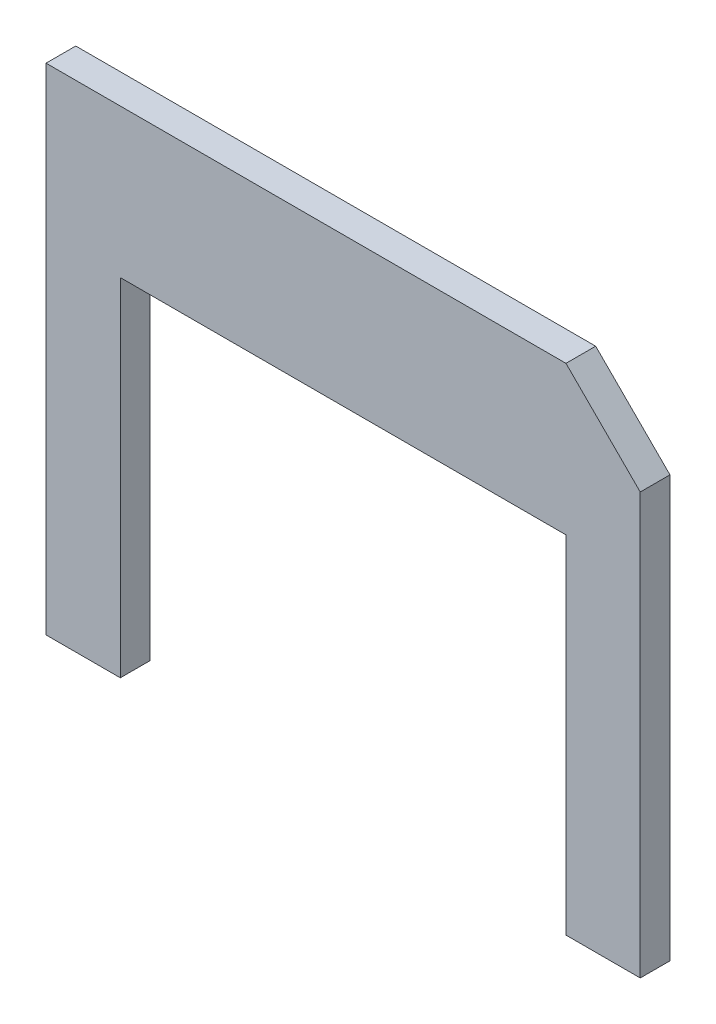
ISO-10303-21;
HEADER;
FILE_DESCRIPTION(('STEP AP214'),'2;1');
FILE_NAME('part.step','',(''),(''),'','','');
FILE_SCHEMA(('AUTOMOTIVE_DESIGN { 1 0 10303 214 1 1 1 1 }'));
ENDSEC;
DATA;
#1=APPLICATION_CONTEXT('core data for automotive mechanical design processes');
#2=APPLICATION_PROTOCOL_DEFINITION('international standard','automotive_design',2000,#1);
#3=PRODUCT_CONTEXT('',#1,'mechanical');
#4=PRODUCT('Part','Part','',(#3));
#5=PRODUCT_RELATED_PRODUCT_CATEGORY('part','',(#4));
#6=PRODUCT_DEFINITION_FORMATION('','',#4);
#7=PRODUCT_DEFINITION_CONTEXT('part definition',#1,'design');
#8=PRODUCT_DEFINITION('design','',#6,#7);
#9=PRODUCT_DEFINITION_SHAPE('','',#8);
#10=(LENGTH_UNIT() NAMED_UNIT(*) SI_UNIT(.MILLI.,.METRE.));
#11=(NAMED_UNIT(*) PLANE_ANGLE_UNIT() SI_UNIT($,.RADIAN.));
#12=(NAMED_UNIT(*) SI_UNIT($,.STERADIAN.) SOLID_ANGLE_UNIT());
#13=UNCERTAINTY_MEASURE_WITH_UNIT(LENGTH_MEASURE(1.E-05),#10,'distance_accuracy_value','');
#14=(GEOMETRIC_REPRESENTATION_CONTEXT(3) GLOBAL_UNCERTAINTY_ASSIGNED_CONTEXT((#13)) GLOBAL_UNIT_ASSIGNED_CONTEXT((#10,
#11,#12)) REPRESENTATION_CONTEXT('',''));
#15=CARTESIAN_POINT('',(0.,0.,0.));
#16=DIRECTION('',(0.,0.,1.));
#17=DIRECTION('',(1.,0.,0.));
#18=AXIS2_PLACEMENT_3D('',#15,#16,#17);
#19=CARTESIAN_POINT('',(1.5,0.,0.6));
#20=DIRECTION('',(0.,1.,0.));
#21=DIRECTION('',(-1.,0.,0.));
#22=AXIS2_PLACEMENT_3D('',#19,#20,#21);
#23=PLANE('',#22);
#24=DIRECTION('',(1.,0.,0.));
#25=VECTOR('',#24,1.);
#26=CARTESIAN_POINT('',(1.5,0.,0.));
#27=LINE('',#26,#25);
#28=CARTESIAN_POINT('',(0.,0.,0.));
#29=VERTEX_POINT('',#28);
#30=CARTESIAN_POINT('',(1.5,0.,0.));
#31=VERTEX_POINT('',#30);
#32=EDGE_CURVE('E138',#29,#31,#27,.T.);
#33=ORIENTED_EDGE('',*,*,#32,.T.);
#34=DIRECTION('',(0.,0.,-1.));
#35=VECTOR('',#34,1.);
#36=CARTESIAN_POINT('',(1.5,0.,0.6));
#37=LINE('',#36,#35);
#38=CARTESIAN_POINT('',(1.5,0.,0.6));
#39=VERTEX_POINT('',#38);
#40=EDGE_CURVE('E11',#39,#31,#37,.T.);
#41=ORIENTED_EDGE('',*,*,#40,.F.);
#42=DIRECTION('',(1.,0.,0.));
#43=VECTOR('',#42,1.);
#44=CARTESIAN_POINT('',(1.5,0.,0.6));
#45=LINE('',#44,#43);
#46=CARTESIAN_POINT('',(0.,0.,0.6));
#47=VERTEX_POINT('',#46);
#48=EDGE_CURVE('E153',#47,#39,#45,.T.);
#49=ORIENTED_EDGE('',*,*,#48,.F.);
#50=DIRECTION('',(0.,0.,-1.));
#51=VECTOR('',#50,1.);
#52=CARTESIAN_POINT('',(0.,0.,0.6));
#53=LINE('',#52,#51);
#54=EDGE_CURVE('E137',#47,#29,#53,.T.);
#55=ORIENTED_EDGE('',*,*,#54,.T.);
#56=EDGE_LOOP('',(#33,#41,#49,#55));
#57=FACE_BOUND('',#56,.T.);
#58=ADVANCED_FACE('F32',(#57),#23,.F.);
#59=CARTESIAN_POINT('',(1.5,7.,0.6));
#60=DIRECTION('',(-1.,0.,0.));
#61=DIRECTION('',(0.,-1.,0.));
#62=AXIS2_PLACEMENT_3D('',#59,#60,#61);
#63=PLANE('',#62);
#64=DIRECTION('',(0.,1.,0.));
#65=VECTOR('',#64,1.);
#66=CARTESIAN_POINT('',(1.5,7.,0.));
#67=LINE('',#66,#65);
#68=CARTESIAN_POINT('',(1.5,7.,0.));
#69=VERTEX_POINT('',#68);
#70=EDGE_CURVE('E141',#31,#69,#67,.T.);
#71=ORIENTED_EDGE('',*,*,#70,.T.);
#72=DIRECTION('',(0.,0.,-1.));
#73=VECTOR('',#72,1.);
#74=CARTESIAN_POINT('',(1.5,7.,0.6));
#75=LINE('',#74,#73);
#76=CARTESIAN_POINT('',(1.5,7.,0.6));
#77=VERTEX_POINT('',#76);
#78=EDGE_CURVE('E39',#77,#69,#75,.T.);
#79=ORIENTED_EDGE('',*,*,#78,.F.);
#80=DIRECTION('',(0.,1.,0.));
#81=VECTOR('',#80,1.);
#82=CARTESIAN_POINT('',(1.5,7.,0.6));
#83=LINE('',#82,#81);
#84=EDGE_CURVE('E93',#39,#77,#83,.T.);
#85=ORIENTED_EDGE('',*,*,#84,.F.);
#86=ORIENTED_EDGE('',*,*,#40,.T.);
#87=EDGE_LOOP('',(#71,#79,#85,#86));
#88=FACE_BOUND('',#87,.T.);
#89=ADVANCED_FACE('F196',(#88),#63,.F.);
#90=CARTESIAN_POINT('',(10.5,7.,0.6));
#91=DIRECTION('',(0.,1.,0.));
#92=DIRECTION('',(-1.,0.,0.));
#93=AXIS2_PLACEMENT_3D('',#90,#91,#92);
#94=PLANE('',#93);
#95=DIRECTION('',(1.,0.,0.));
#96=VECTOR('',#95,1.);
#97=CARTESIAN_POINT('',(10.5,7.,0.));
#98=LINE('',#97,#96);
#99=CARTESIAN_POINT('',(10.5,7.,0.));
#100=VERTEX_POINT('',#99);
#101=EDGE_CURVE('E143',#69,#100,#98,.T.);
#102=ORIENTED_EDGE('',*,*,#101,.T.);
#103=DIRECTION('',(0.,0.,-1.));
#104=VECTOR('',#103,1.);
#105=CARTESIAN_POINT('',(10.5,7.,0.6));
#106=LINE('',#105,#104);
#107=CARTESIAN_POINT('',(10.5,7.,0.6));
#108=VERTEX_POINT('',#107);
#109=EDGE_CURVE('E157',#108,#100,#106,.T.);
#110=ORIENTED_EDGE('',*,*,#109,.F.);
#111=DIRECTION('',(1.,0.,0.));
#112=VECTOR('',#111,1.);
#113=CARTESIAN_POINT('',(10.5,7.,0.6));
#114=LINE('',#113,#112);
#115=EDGE_CURVE('E165',#77,#108,#114,.T.);
#116=ORIENTED_EDGE('',*,*,#115,.F.);
#117=ORIENTED_EDGE('',*,*,#78,.T.);
#118=EDGE_LOOP('',(#102,#110,#116,#117));
#119=FACE_BOUND('',#118,.T.);
#120=ADVANCED_FACE('F163',(#119),#94,.F.);
#121=CARTESIAN_POINT('',(10.5,7.,0.6));
#122=DIRECTION('',(1.,0.,0.));
#123=DIRECTION('',(0.,1.,0.));
#124=AXIS2_PLACEMENT_3D('',#121,#122,#123);
#125=PLANE('',#124);
#126=DIRECTION('',(0.,-1.,0.));
#127=VECTOR('',#126,1.);
#128=CARTESIAN_POINT('',(10.5,7.,0.));
#129=LINE('',#128,#127);
#130=CARTESIAN_POINT('',(10.5,0.,0.));
#131=VERTEX_POINT('',#130);
#132=EDGE_CURVE('E145',#100,#131,#129,.T.);
#133=ORIENTED_EDGE('',*,*,#132,.T.);
#134=DIRECTION('',(0.,0.,-1.));
#135=VECTOR('',#134,1.);
#136=CARTESIAN_POINT('',(10.5,0.,0.6));
#137=LINE('',#136,#135);
#138=CARTESIAN_POINT('',(10.5,0.,0.6));
#139=VERTEX_POINT('',#138);
#140=EDGE_CURVE('E127',#139,#131,#137,.T.);
#141=ORIENTED_EDGE('',*,*,#140,.F.);
#142=DIRECTION('',(0.,-1.,0.));
#143=VECTOR('',#142,1.);
#144=CARTESIAN_POINT('',(10.5,7.,0.6));
#145=LINE('',#144,#143);
#146=EDGE_CURVE('E114',#108,#139,#145,.T.);
#147=ORIENTED_EDGE('',*,*,#146,.F.);
#148=ORIENTED_EDGE('',*,*,#109,.T.);
#149=EDGE_LOOP('',(#133,#141,#147,#148));
#150=FACE_BOUND('',#149,.T.);
#151=ADVANCED_FACE('F171',(#150),#125,.F.);
#152=CARTESIAN_POINT('',(12.,0.,0.6));
#153=DIRECTION('',(0.,1.,0.));
#154=DIRECTION('',(-1.,0.,0.));
#155=AXIS2_PLACEMENT_3D('',#152,#153,#154);
#156=PLANE('',#155);
#157=DIRECTION('',(1.,0.,0.));
#158=VECTOR('',#157,1.);
#159=CARTESIAN_POINT('',(12.,0.,0.));
#160=LINE('',#159,#158);
#161=CARTESIAN_POINT('',(12.,0.,0.));
#162=VERTEX_POINT('',#161);
#163=EDGE_CURVE('E123',#131,#162,#160,.T.);
#164=ORIENTED_EDGE('',*,*,#163,.T.);
#165=DIRECTION('',(0.,0.,-1.));
#166=VECTOR('',#165,1.);
#167=CARTESIAN_POINT('',(12.,0.,0.6));
#168=LINE('',#167,#166);
#169=CARTESIAN_POINT('',(12.,0.,0.6));
#170=VERTEX_POINT('',#169);
#171=EDGE_CURVE('E120',#170,#162,#168,.T.);
#172=ORIENTED_EDGE('',*,*,#171,.F.);
#173=DIRECTION('',(1.,0.,0.));
#174=VECTOR('',#173,1.);
#175=CARTESIAN_POINT('',(12.,0.,0.6));
#176=LINE('',#175,#174);
#177=EDGE_CURVE('E107',#139,#170,#176,.T.);
#178=ORIENTED_EDGE('',*,*,#177,.F.);
#179=ORIENTED_EDGE('',*,*,#140,.T.);
#180=EDGE_LOOP('',(#164,#172,#178,#179));
#181=FACE_BOUND('',#180,.T.);
#182=ADVANCED_FACE('F121',(#181),#156,.F.);
#183=CARTESIAN_POINT('',(12.,10.,0.6));
#184=DIRECTION('',(-1.,0.,0.));
#185=DIRECTION('',(0.,-1.,0.));
#186=AXIS2_PLACEMENT_3D('',#183,#184,#185);
#187=PLANE('',#186);
#188=DIRECTION('',(0.,1.,0.));
#189=VECTOR('',#188,1.);
#190=CARTESIAN_POINT('',(12.,10.,0.));
#191=LINE('',#190,#189);
#192=CARTESIAN_POINT('',(12.,8.50000000000001,0.));
#193=VERTEX_POINT('',#192);
#194=EDGE_CURVE('E148',#162,#193,#191,.T.);
#195=ORIENTED_EDGE('',*,*,#194,.T.);
#196=DIRECTION('',(0.,0.,1.));
#197=VECTOR('',#196,1.);
#198=CARTESIAN_POINT('',(12.,8.5,0.));
#199=LINE('',#198,#197);
#200=CARTESIAN_POINT('',(12.,8.5,0.6));
#201=VERTEX_POINT('',#200);
#202=EDGE_CURVE('E46',#193,#201,#199,.T.);
#203=ORIENTED_EDGE('',*,*,#202,.T.);
#204=DIRECTION('',(0.,1.,0.));
#205=VECTOR('',#204,1.);
#206=CARTESIAN_POINT('',(12.,10.,0.6));
#207=LINE('',#206,#205);
#208=EDGE_CURVE('E112',#170,#201,#207,.T.);
#209=ORIENTED_EDGE('',*,*,#208,.F.);
#210=ORIENTED_EDGE('',*,*,#171,.T.);
#211=EDGE_LOOP('',(#195,#203,#209,#210));
#212=FACE_BOUND('',#211,.T.);
#213=ADVANCED_FACE('F130',(#212),#187,.F.);
#214=CARTESIAN_POINT('',(0.,10.,0.6));
#215=DIRECTION('',(0.,-1.,0.));
#216=DIRECTION('',(0.,0.,-1.));
#217=AXIS2_PLACEMENT_3D('',#214,#215,#216);
#218=PLANE('',#217);
#219=DIRECTION('',(-1.,0.,0.));
#220=VECTOR('',#219,1.);
#221=CARTESIAN_POINT('',(0.,10.,0.6));
#222=LINE('',#221,#220);
#223=CARTESIAN_POINT('',(10.5,10.,0.6));
#224=VERTEX_POINT('',#223);
#225=CARTESIAN_POINT('',(0.,10.,0.6));
#226=VERTEX_POINT('',#225);
#227=EDGE_CURVE('E131',#224,#226,#222,.T.);
#228=ORIENTED_EDGE('',*,*,#227,.F.);
#229=DIRECTION('',(0.,0.,1.));
#230=VECTOR('',#229,1.);
#231=CARTESIAN_POINT('',(10.5,10.,0.));
#232=LINE('',#231,#230);
#233=CARTESIAN_POINT('',(10.5,10.,0.));
#234=VERTEX_POINT('',#233);
#235=EDGE_CURVE('E176',#234,#224,#232,.T.);
#236=ORIENTED_EDGE('',*,*,#235,.F.);
#237=DIRECTION('',(-1.,0.,0.));
#238=VECTOR('',#237,1.);
#239=CARTESIAN_POINT('',(0.,10.,0.));
#240=LINE('',#239,#238);
#241=CARTESIAN_POINT('',(0.,10.,0.));
#242=VERTEX_POINT('',#241);
#243=EDGE_CURVE('E150',#234,#242,#240,.T.);
#244=ORIENTED_EDGE('',*,*,#243,.T.);
#245=DIRECTION('',(0.,0.,-1.));
#246=VECTOR('',#245,1.);
#247=CARTESIAN_POINT('',(0.,10.,0.6));
#248=LINE('',#247,#246);
#249=EDGE_CURVE('E128',#226,#242,#248,.T.);
#250=ORIENTED_EDGE('',*,*,#249,.F.);
#251=EDGE_LOOP('',(#228,#236,#244,#250));
#252=FACE_BOUND('',#251,.T.);
#253=ADVANCED_FACE('F190',(#252),#218,.F.);
#254=CARTESIAN_POINT('',(0.,0.,0.6));
#255=DIRECTION('',(1.,0.,0.));
#256=DIRECTION('',(0.,0.,-1.));
#257=AXIS2_PLACEMENT_3D('',#254,#255,#256);
#258=PLANE('',#257);
#259=DIRECTION('',(0.,-1.,0.));
#260=VECTOR('',#259,1.);
#261=CARTESIAN_POINT('',(0.,0.,0.));
#262=LINE('',#261,#260);
#263=EDGE_CURVE('E85',#242,#29,#262,.T.);
#264=ORIENTED_EDGE('',*,*,#263,.T.);
#265=ORIENTED_EDGE('',*,*,#54,.F.);
#266=DIRECTION('',(0.,-1.,0.));
#267=VECTOR('',#266,1.);
#268=CARTESIAN_POINT('',(0.,0.,0.6));
#269=LINE('',#268,#267);
#270=EDGE_CURVE('E55',#226,#47,#269,.T.);
#271=ORIENTED_EDGE('',*,*,#270,.F.);
#272=ORIENTED_EDGE('',*,*,#249,.T.);
#273=EDGE_LOOP('',(#264,#265,#271,#272));
#274=FACE_BOUND('',#273,.T.);
#275=ADVANCED_FACE('F192',(#274),#258,.F.);
#276=CARTESIAN_POINT('',(0.,0.,0.6));
#277=DIRECTION('',(0.,0.,-1.));
#278=DIRECTION('',(-1.,0.,0.));
#279=AXIS2_PLACEMENT_3D('',#276,#277,#278);
#280=PLANE('',#279);
#281=ORIENTED_EDGE('',*,*,#208,.T.);
#282=DIRECTION('',(0.707106781186548,-0.707106781186547,0.));
#283=VECTOR('',#282,1.);
#284=CARTESIAN_POINT('',(10.5,10.,0.6));
#285=LINE('',#284,#283);
#286=EDGE_CURVE('E181',#224,#201,#285,.T.);
#287=ORIENTED_EDGE('',*,*,#286,.F.);
#288=ORIENTED_EDGE('',*,*,#227,.T.);
#289=ORIENTED_EDGE('',*,*,#270,.T.);
#290=ORIENTED_EDGE('',*,*,#48,.T.);
#291=ORIENTED_EDGE('',*,*,#84,.T.);
#292=ORIENTED_EDGE('',*,*,#115,.T.);
#293=ORIENTED_EDGE('',*,*,#146,.T.);
#294=ORIENTED_EDGE('',*,*,#177,.T.);
#295=EDGE_LOOP('',(#281,#287,#288,#289,#290,#291,#292,#293,#294));
#296=FACE_BOUND('',#295,.T.);
#297=ADVANCED_FACE('F109',(#296),#280,.F.);
#298=CARTESIAN_POINT('',(0.,0.,0.));
#299=DIRECTION('',(0.,0.,-1.));
#300=DIRECTION('',(-1.,0.,0.));
#301=AXIS2_PLACEMENT_3D('',#298,#299,#300);
#302=PLANE('',#301);
#303=DIRECTION('',(0.707106781186548,-0.707106781186547,0.));
#304=VECTOR('',#303,1.);
#305=CARTESIAN_POINT('',(10.5,10.,0.));
#306=LINE('',#305,#304);
#307=EDGE_CURVE('E179',#234,#193,#306,.T.);
#308=ORIENTED_EDGE('',*,*,#307,.T.);
#309=ORIENTED_EDGE('',*,*,#194,.F.);
#310=ORIENTED_EDGE('',*,*,#163,.F.);
#311=ORIENTED_EDGE('',*,*,#132,.F.);
#312=ORIENTED_EDGE('',*,*,#101,.F.);
#313=ORIENTED_EDGE('',*,*,#70,.F.);
#314=ORIENTED_EDGE('',*,*,#32,.F.);
#315=ORIENTED_EDGE('',*,*,#263,.F.);
#316=ORIENTED_EDGE('',*,*,#243,.F.);
#317=EDGE_LOOP('',(#308,#309,#310,#311,#312,#313,#314,#315,#316));
#318=FACE_BOUND('',#317,.T.);
#319=ADVANCED_FACE('F168',(#318),#302,.T.);
#320=CARTESIAN_POINT('',(10.5,10.,0.));
#321=DIRECTION('',(-0.707106781186547,-0.707106781186548,0.));
#322=DIRECTION('',(0.707106781186548,-0.707106781186547,0.));
#323=AXIS2_PLACEMENT_3D('',#320,#321,#322);
#324=PLANE('',#323);
#325=ORIENTED_EDGE('',*,*,#286,.T.);
#326=ORIENTED_EDGE('',*,*,#202,.F.);
#327=ORIENTED_EDGE('',*,*,#307,.F.);
#328=ORIENTED_EDGE('',*,*,#235,.T.);
#329=EDGE_LOOP('',(#325,#326,#327,#328));
#330=FACE_BOUND('',#329,.T.);
#331=ADVANCED_FACE('F185',(#330),#324,.F.);
#332=CLOSED_SHELL('',(#58,#89,#120,#151,#182,#213,#253,#275,#297,#319,#331));
#333=MANIFOLD_SOLID_BREP('B2',#332);
#334=ADVANCED_BREP_SHAPE_REPRESENTATION('',(#18,#333),#14);
#335=SHAPE_DEFINITION_REPRESENTATION(#9,#334);
ENDSEC;
END-ISO-10303-21;
